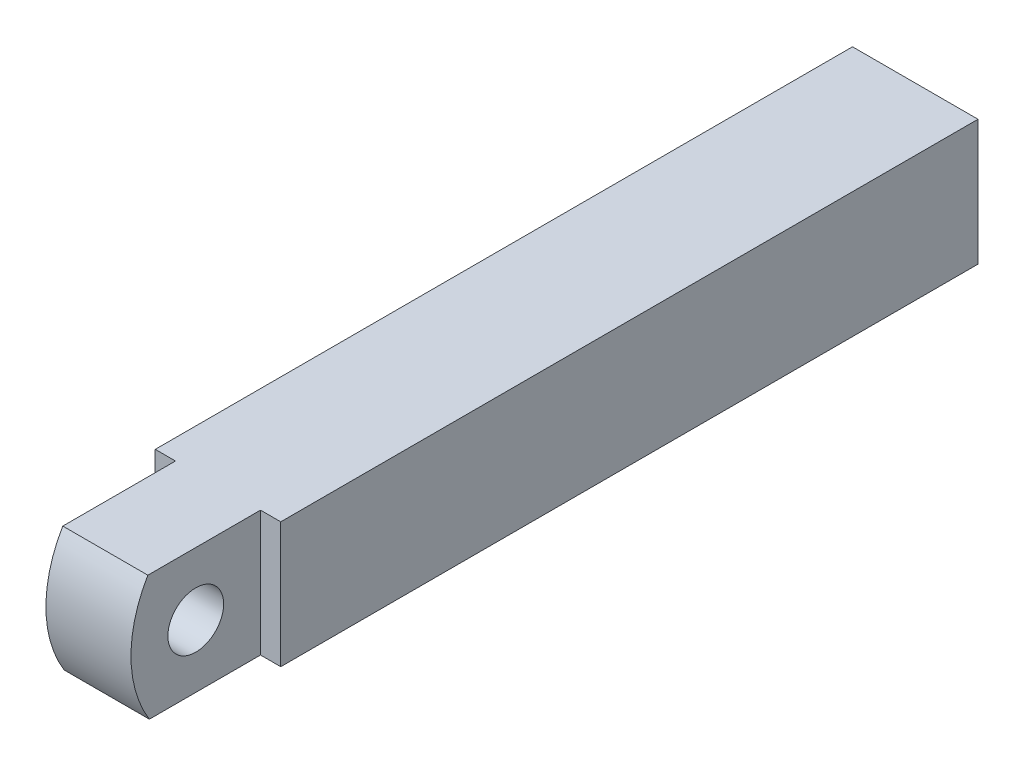
ISO-10303-21;
HEADER;
FILE_DESCRIPTION(('STEP AP214'),'2;1');
FILE_NAME('part.step','',(''),(''),'','','');
FILE_SCHEMA(('AUTOMOTIVE_DESIGN { 1 0 10303 214 1 1 1 1 }'));
ENDSEC;
DATA;
#1=APPLICATION_CONTEXT('core data for automotive mechanical design processes');
#2=APPLICATION_PROTOCOL_DEFINITION('international standard','automotive_design',2000,#1);
#3=PRODUCT_CONTEXT('',#1,'mechanical');
#4=PRODUCT('Part','Part','',(#3));
#5=PRODUCT_RELATED_PRODUCT_CATEGORY('part','',(#4));
#6=PRODUCT_DEFINITION_FORMATION('','',#4);
#7=PRODUCT_DEFINITION_CONTEXT('part definition',#1,'design');
#8=PRODUCT_DEFINITION('design','',#6,#7);
#9=PRODUCT_DEFINITION_SHAPE('','',#8);
#10=(LENGTH_UNIT() NAMED_UNIT(*) SI_UNIT(.MILLI.,.METRE.));
#11=(NAMED_UNIT(*) PLANE_ANGLE_UNIT() SI_UNIT($,.RADIAN.));
#12=(NAMED_UNIT(*) SI_UNIT($,.STERADIAN.) SOLID_ANGLE_UNIT());
#13=UNCERTAINTY_MEASURE_WITH_UNIT(LENGTH_MEASURE(1.E-05),#10,'distance_accuracy_value','');
#14=(GEOMETRIC_REPRESENTATION_CONTEXT(3) GLOBAL_UNCERTAINTY_ASSIGNED_CONTEXT((#13)) GLOBAL_UNIT_ASSIGNED_CONTEXT((#10,
#11,#12)) REPRESENTATION_CONTEXT('',''));
#15=CARTESIAN_POINT('',(0.,0.,0.));
#16=DIRECTION('',(0.,0.,1.));
#17=DIRECTION('',(1.,0.,0.));
#18=AXIS2_PLACEMENT_3D('',#15,#16,#17);
#19=CARTESIAN_POINT('',(0.,0.,50.));
#20=DIRECTION('',(0.,0.,1.));
#21=DIRECTION('',(1.,0.,0.));
#22=AXIS2_PLACEMENT_3D('',#19,#20,#21);
#23=PLANE('',#22);
#24=DIRECTION('',(-1.,0.,0.));
#25=VECTOR('',#24,1.);
#26=CARTESIAN_POINT('',(-4.5,4.5,50.));
#27=LINE('',#26,#25);
#28=CARTESIAN_POINT('',(4.5,4.5,50.));
#29=VERTEX_POINT('',#28);
#30=CARTESIAN_POINT('',(3.05,4.5,50.));
#31=VERTEX_POINT('',#30);
#32=EDGE_CURVE('E152',#29,#31,#27,.T.);
#33=ORIENTED_EDGE('',*,*,#32,.T.);
#34=DIRECTION('',(0.,-1.,0.));
#35=VECTOR('',#34,1.);
#36=CARTESIAN_POINT('',(3.05,0.,50.));
#37=LINE('',#36,#35);
#38=CARTESIAN_POINT('',(3.05,-4.5,50.));
#39=VERTEX_POINT('',#38);
#40=EDGE_CURVE('E54',#31,#39,#37,.T.);
#41=ORIENTED_EDGE('',*,*,#40,.T.);
#42=DIRECTION('',(1.,0.,0.));
#43=VECTOR('',#42,1.);
#44=CARTESIAN_POINT('',(-4.5,-4.5,50.));
#45=LINE('',#44,#43);
#46=CARTESIAN_POINT('',(4.5,-4.5,50.));
#47=VERTEX_POINT('',#46);
#48=EDGE_CURVE('E156',#39,#47,#45,.T.);
#49=ORIENTED_EDGE('',*,*,#48,.T.);
#50=DIRECTION('',(0.,1.,0.));
#51=VECTOR('',#50,1.);
#52=CARTESIAN_POINT('',(4.5,4.5,50.));
#53=LINE('',#52,#51);
#54=EDGE_CURVE('E147',#47,#29,#53,.T.);
#55=ORIENTED_EDGE('',*,*,#54,.T.);
#56=EDGE_LOOP('',(#33,#41,#49,#55));
#57=FACE_BOUND('',#56,.T.);
#58=ADVANCED_FACE('F39',(#57),#23,.T.);
#59=CARTESIAN_POINT('',(4.5,4.5,50.));
#60=DIRECTION('',(-1.,0.,0.));
#61=DIRECTION('',(0.,-1.,0.));
#62=AXIS2_PLACEMENT_3D('',#59,#60,#61);
#63=PLANE('',#62);
#64=DIRECTION('',(0.,1.,0.));
#65=VECTOR('',#64,1.);
#66=CARTESIAN_POINT('',(4.5,4.5,0.));
#67=LINE('',#66,#65);
#68=CARTESIAN_POINT('',(4.5,-4.5,0.));
#69=VERTEX_POINT('',#68);
#70=CARTESIAN_POINT('',(4.5,4.5,0.));
#71=VERTEX_POINT('',#70);
#72=EDGE_CURVE('E145',#69,#71,#67,.T.);
#73=ORIENTED_EDGE('',*,*,#72,.T.);
#74=DIRECTION('',(0.,0.,-1.));
#75=VECTOR('',#74,1.);
#76=CARTESIAN_POINT('',(4.5,4.5,50.));
#77=LINE('',#76,#75);
#78=EDGE_CURVE('E11',#29,#71,#77,.T.);
#79=ORIENTED_EDGE('',*,*,#78,.F.);
#80=ORIENTED_EDGE('',*,*,#54,.F.);
#81=DIRECTION('',(0.,0.,-1.));
#82=VECTOR('',#81,1.);
#83=CARTESIAN_POINT('',(4.5,-4.5,50.));
#84=LINE('',#83,#82);
#85=EDGE_CURVE('E159',#47,#69,#84,.T.);
#86=ORIENTED_EDGE('',*,*,#85,.T.);
#87=EDGE_LOOP('',(#73,#79,#80,#86));
#88=FACE_BOUND('',#87,.T.);
#89=ADVANCED_FACE('F41',(#88),#63,.F.);
#90=CARTESIAN_POINT('',(-4.5,4.5,50.));
#91=DIRECTION('',(0.,-1.,0.));
#92=DIRECTION('',(0.,0.,-1.));
#93=AXIS2_PLACEMENT_3D('',#90,#91,#92);
#94=PLANE('',#93);
#95=DIRECTION('',(-1.,0.,0.));
#96=VECTOR('',#95,1.);
#97=CARTESIAN_POINT('',(-4.5,4.5,0.));
#98=LINE('',#97,#96);
#99=CARTESIAN_POINT('',(-4.5,4.5,0.));
#100=VERTEX_POINT('',#99);
#101=EDGE_CURVE('E162',#71,#100,#98,.T.);
#102=ORIENTED_EDGE('',*,*,#101,.T.);
#103=DIRECTION('',(0.,0.,-1.));
#104=VECTOR('',#103,1.);
#105=CARTESIAN_POINT('',(-4.5,4.5,50.));
#106=LINE('',#105,#104);
#107=CARTESIAN_POINT('',(-4.5,4.5,50.));
#108=VERTEX_POINT('',#107);
#109=EDGE_CURVE('E47',#108,#100,#106,.T.);
#110=ORIENTED_EDGE('',*,*,#109,.F.);
#111=CARTESIAN_POINT('',(-3.05,4.5,50.));
#112=VERTEX_POINT('',#111);
#113=EDGE_CURVE('E150',#112,#108,#27,.T.);
#114=ORIENTED_EDGE('',*,*,#113,.F.);
#115=DIRECTION('',(0.,0.,-1.));
#116=VECTOR('',#115,1.);
#117=CARTESIAN_POINT('',(-3.05,4.5,0.));
#118=LINE('',#117,#116);
#119=CARTESIAN_POINT('',(-3.05,4.5,58.0805418188666));
#120=VERTEX_POINT('',#119);
#121=EDGE_CURVE('E130',#120,#112,#118,.T.);
#122=ORIENTED_EDGE('',*,*,#121,.F.);
#123=DIRECTION('',(1.,0.,0.));
#124=VECTOR('',#123,1.);
#125=CARTESIAN_POINT('',(-3.05,4.5,58.0805418188666));
#126=LINE('',#125,#124);
#127=CARTESIAN_POINT('',(3.05,4.5,58.0805418188666));
#128=VERTEX_POINT('',#127);
#129=EDGE_CURVE('E115',#120,#128,#126,.T.);
#130=ORIENTED_EDGE('',*,*,#129,.T.);
#131=DIRECTION('',(0.,0.,-1.));
#132=VECTOR('',#131,1.);
#133=CARTESIAN_POINT('',(3.05,4.5,0.));
#134=LINE('',#133,#132);
#135=EDGE_CURVE('E140',#128,#31,#134,.T.);
#136=ORIENTED_EDGE('',*,*,#135,.T.);
#137=ORIENTED_EDGE('',*,*,#32,.F.);
#138=ORIENTED_EDGE('',*,*,#78,.T.);
#139=EDGE_LOOP('',(#102,#110,#114,#122,#130,#136,#137,#138));
#140=FACE_BOUND('',#139,.T.);
#141=ADVANCED_FACE('F190',(#140),#94,.F.);
#142=CARTESIAN_POINT('',(-4.5,4.5,50.));
#143=DIRECTION('',(1.,0.,0.));
#144=DIRECTION('',(0.,0.,-1.));
#145=AXIS2_PLACEMENT_3D('',#142,#143,#144);
#146=PLANE('',#145);
#147=DIRECTION('',(0.,-1.,0.));
#148=VECTOR('',#147,1.);
#149=CARTESIAN_POINT('',(-4.5,4.5,0.));
#150=LINE('',#149,#148);
#151=CARTESIAN_POINT('',(-4.5,-4.5,0.));
#152=VERTEX_POINT('',#151);
#153=EDGE_CURVE('E164',#100,#152,#150,.T.);
#154=ORIENTED_EDGE('',*,*,#153,.T.);
#155=DIRECTION('',(0.,0.,-1.));
#156=VECTOR('',#155,1.);
#157=CARTESIAN_POINT('',(-4.5,-4.5,50.));
#158=LINE('',#157,#156);
#159=CARTESIAN_POINT('',(-4.5,-4.5,50.));
#160=VERTEX_POINT('',#159);
#161=EDGE_CURVE('E169',#160,#152,#158,.T.);
#162=ORIENTED_EDGE('',*,*,#161,.F.);
#163=DIRECTION('',(0.,-1.,0.));
#164=VECTOR('',#163,1.);
#165=CARTESIAN_POINT('',(-4.5,4.5,50.));
#166=LINE('',#165,#164);
#167=EDGE_CURVE('E154',#108,#160,#166,.T.);
#168=ORIENTED_EDGE('',*,*,#167,.F.);
#169=ORIENTED_EDGE('',*,*,#109,.T.);
#170=EDGE_LOOP('',(#154,#162,#168,#169));
#171=FACE_BOUND('',#170,.T.);
#172=ADVANCED_FACE('F176',(#171),#146,.F.);
#173=CARTESIAN_POINT('',(-4.5,-4.5,50.));
#174=DIRECTION('',(0.,1.,0.));
#175=DIRECTION('',(0.,0.,1.));
#176=AXIS2_PLACEMENT_3D('',#173,#174,#175);
#177=PLANE('',#176);
#178=DIRECTION('',(1.,0.,0.));
#179=VECTOR('',#178,1.);
#180=CARTESIAN_POINT('',(-4.5,-4.5,0.));
#181=LINE('',#180,#179);
#182=EDGE_CURVE('E151',#152,#69,#181,.T.);
#183=ORIENTED_EDGE('',*,*,#182,.T.);
#184=ORIENTED_EDGE('',*,*,#85,.F.);
#185=ORIENTED_EDGE('',*,*,#48,.F.);
#186=DIRECTION('',(0.,0.,-1.));
#187=VECTOR('',#186,1.);
#188=CARTESIAN_POINT('',(3.05,-4.5,0.));
#189=LINE('',#188,#187);
#190=CARTESIAN_POINT('',(3.05,-4.5,57.9708852085071));
#191=VERTEX_POINT('',#190);
#192=EDGE_CURVE('E111',#191,#39,#189,.T.);
#193=ORIENTED_EDGE('',*,*,#192,.F.);
#194=DIRECTION('',(1.,0.,0.));
#195=VECTOR('',#194,1.);
#196=CARTESIAN_POINT('',(-3.05,-4.5,57.9708852085071));
#197=LINE('',#196,#195);
#198=CARTESIAN_POINT('',(-3.05,-4.5,57.9708852085071));
#199=VERTEX_POINT('',#198);
#200=EDGE_CURVE('E104',#199,#191,#197,.T.);
#201=ORIENTED_EDGE('',*,*,#200,.F.);
#202=DIRECTION('',(0.,0.,-1.));
#203=VECTOR('',#202,1.);
#204=CARTESIAN_POINT('',(-3.05,-4.5,0.));
#205=LINE('',#204,#203);
#206=CARTESIAN_POINT('',(-3.05,-4.5,50.));
#207=VERTEX_POINT('',#206);
#208=EDGE_CURVE('E109',#199,#207,#205,.T.);
#209=ORIENTED_EDGE('',*,*,#208,.T.);
#210=EDGE_CURVE('E157',#160,#207,#45,.T.);
#211=ORIENTED_EDGE('',*,*,#210,.F.);
#212=ORIENTED_EDGE('',*,*,#161,.T.);
#213=EDGE_LOOP('',(#183,#184,#185,#193,#201,#209,#211,#212));
#214=FACE_BOUND('',#213,.T.);
#215=ADVANCED_FACE('F106',(#214),#177,.F.);
#216=DIRECTION('',(0.,-1.,0.));
#217=VECTOR('',#216,1.);
#218=CARTESIAN_POINT('',(-3.05,0.,50.));
#219=LINE('',#218,#217);
#220=EDGE_CURVE('E62',#112,#207,#219,.T.);
#221=ORIENTED_EDGE('',*,*,#220,.F.);
#222=ORIENTED_EDGE('',*,*,#113,.T.);
#223=ORIENTED_EDGE('',*,*,#167,.T.);
#224=ORIENTED_EDGE('',*,*,#210,.T.);
#225=EDGE_LOOP('',(#221,#222,#223,#224));
#226=FACE_BOUND('',#225,.T.);
#227=ADVANCED_FACE('F191',(#226),#23,.T.);
#228=CARTESIAN_POINT('',(0.,0.,0.));
#229=DIRECTION('',(0.,0.,1.));
#230=DIRECTION('',(1.,0.,0.));
#231=AXIS2_PLACEMENT_3D('',#228,#229,#230);
#232=PLANE('',#231);
#233=ORIENTED_EDGE('',*,*,#72,.F.);
#234=ORIENTED_EDGE('',*,*,#182,.F.);
#235=ORIENTED_EDGE('',*,*,#153,.F.);
#236=ORIENTED_EDGE('',*,*,#101,.F.);
#237=EDGE_LOOP('',(#233,#234,#235,#236));
#238=FACE_BOUND('',#237,.T.);
#239=ADVANCED_FACE('F182',(#238),#232,.F.);
#240=CARTESIAN_POINT('',(-3.05,0.0899271139939223,50.645));
#241=DIRECTION('',(1.,0.,0.));
#242=DIRECTION('',(0.,1.,0.));
#243=AXIS2_PLACEMENT_3D('',#240,#241,#242);
#244=CYLINDRICAL_SURFACE('',#243,8.64500000000001);
#245=CARTESIAN_POINT('',(3.05,0.0899271139939229,50.645));
#246=DIRECTION('',(1.,0.,0.));
#247=DIRECTION('',(0.,1.,0.));
#248=AXIS2_PLACEMENT_3D('',#245,#246,#247);
#249=CIRCLE('',#248,8.64500000000001);
#250=EDGE_CURVE('E136',#191,#128,#249,.F.);
#251=ORIENTED_EDGE('',*,*,#250,.T.);
#252=ORIENTED_EDGE('',*,*,#129,.F.);
#253=CARTESIAN_POINT('',(-3.05,0.0899271139939223,50.645));
#254=DIRECTION('',(1.,0.,0.));
#255=DIRECTION('',(0.,1.,0.));
#256=AXIS2_PLACEMENT_3D('',#253,#254,#255);
#257=CIRCLE('',#256,8.64500000000001);
#258=EDGE_CURVE('E120',#199,#120,#257,.F.);
#259=ORIENTED_EDGE('',*,*,#258,.F.);
#260=ORIENTED_EDGE('',*,*,#200,.T.);
#261=EDGE_LOOP('',(#251,#252,#259,#260));
#262=FACE_BOUND('',#261,.T.);
#263=ADVANCED_FACE('F121',(#262),#244,.T.);
#264=CARTESIAN_POINT('',(-3.05,0.,54.645));
#265=DIRECTION('',(1.,0.,0.));
#266=DIRECTION('',(0.,1.,0.));
#267=AXIS2_PLACEMENT_3D('',#264,#265,#266);
#268=CYLINDRICAL_SURFACE('',#267,2.);
#269=CARTESIAN_POINT('',(-3.05,0.,54.645));
#270=DIRECTION('',(1.,0.,0.));
#271=DIRECTION('',(0.,1.,0.));
#272=AXIS2_PLACEMENT_3D('',#269,#270,#271);
#273=CIRCLE('',#272,2.);
#274=CARTESIAN_POINT('',(-3.05,2.,54.645));
#275=VERTEX_POINT('',#274);
#276=EDGE_CURVE('E116',#275,#275,#273,.T.);
#277=ORIENTED_EDGE('',*,*,#276,.F.);
#278=EDGE_LOOP('',(#277));
#279=FACE_BOUND('',#278,.T.);
#280=CARTESIAN_POINT('',(3.05,0.,54.645));
#281=DIRECTION('',(1.,0.,0.));
#282=DIRECTION('',(0.,1.,0.));
#283=AXIS2_PLACEMENT_3D('',#280,#281,#282);
#284=CIRCLE('',#283,2.);
#285=CARTESIAN_POINT('',(3.05,2.,54.645));
#286=VERTEX_POINT('',#285);
#287=EDGE_CURVE('E125',#286,#286,#284,.T.);
#288=ORIENTED_EDGE('',*,*,#287,.T.);
#289=EDGE_LOOP('',(#288));
#290=FACE_BOUND('',#289,.T.);
#291=ADVANCED_FACE('F256',(#279,#290),#268,.F.);
#292=CARTESIAN_POINT('',(-3.05,0.,0.));
#293=DIRECTION('',(1.,0.,0.));
#294=DIRECTION('',(0.,1.,0.));
#295=AXIS2_PLACEMENT_3D('',#292,#293,#294);
#296=PLANE('',#295);
#297=ORIENTED_EDGE('',*,*,#258,.T.);
#298=ORIENTED_EDGE('',*,*,#121,.T.);
#299=ORIENTED_EDGE('',*,*,#220,.T.);
#300=ORIENTED_EDGE('',*,*,#208,.F.);
#301=EDGE_LOOP('',(#297,#298,#299,#300));
#302=FACE_BOUND('',#301,.T.);
#303=ORIENTED_EDGE('',*,*,#276,.T.);
#304=EDGE_LOOP('',(#303));
#305=FACE_BOUND('',#304,.T.);
#306=ADVANCED_FACE('F127',(#302,#305),#296,.F.);
#307=CARTESIAN_POINT('',(3.05,0.,0.));
#308=DIRECTION('',(1.,0.,0.));
#309=DIRECTION('',(0.,1.,0.));
#310=AXIS2_PLACEMENT_3D('',#307,#308,#309);
#311=PLANE('',#310);
#312=ORIENTED_EDGE('',*,*,#250,.F.);
#313=ORIENTED_EDGE('',*,*,#192,.T.);
#314=ORIENTED_EDGE('',*,*,#40,.F.);
#315=ORIENTED_EDGE('',*,*,#135,.F.);
#316=EDGE_LOOP('',(#312,#313,#314,#315));
#317=FACE_BOUND('',#316,.T.);
#318=ORIENTED_EDGE('',*,*,#287,.F.);
#319=EDGE_LOOP('',(#318));
#320=FACE_BOUND('',#319,.T.);
#321=ADVANCED_FACE('F188',(#317,#320),#311,.T.);
#322=CLOSED_SHELL('',(#58,#89,#141,#172,#215,#227,#239,#263,#291,#306,#321));
#323=MANIFOLD_SOLID_BREP('B2',#322);
#324=ADVANCED_BREP_SHAPE_REPRESENTATION('',(#18,#323),#14);
#325=SHAPE_DEFINITION_REPRESENTATION(#9,#324);
ENDSEC;
END-ISO-10303-21;
